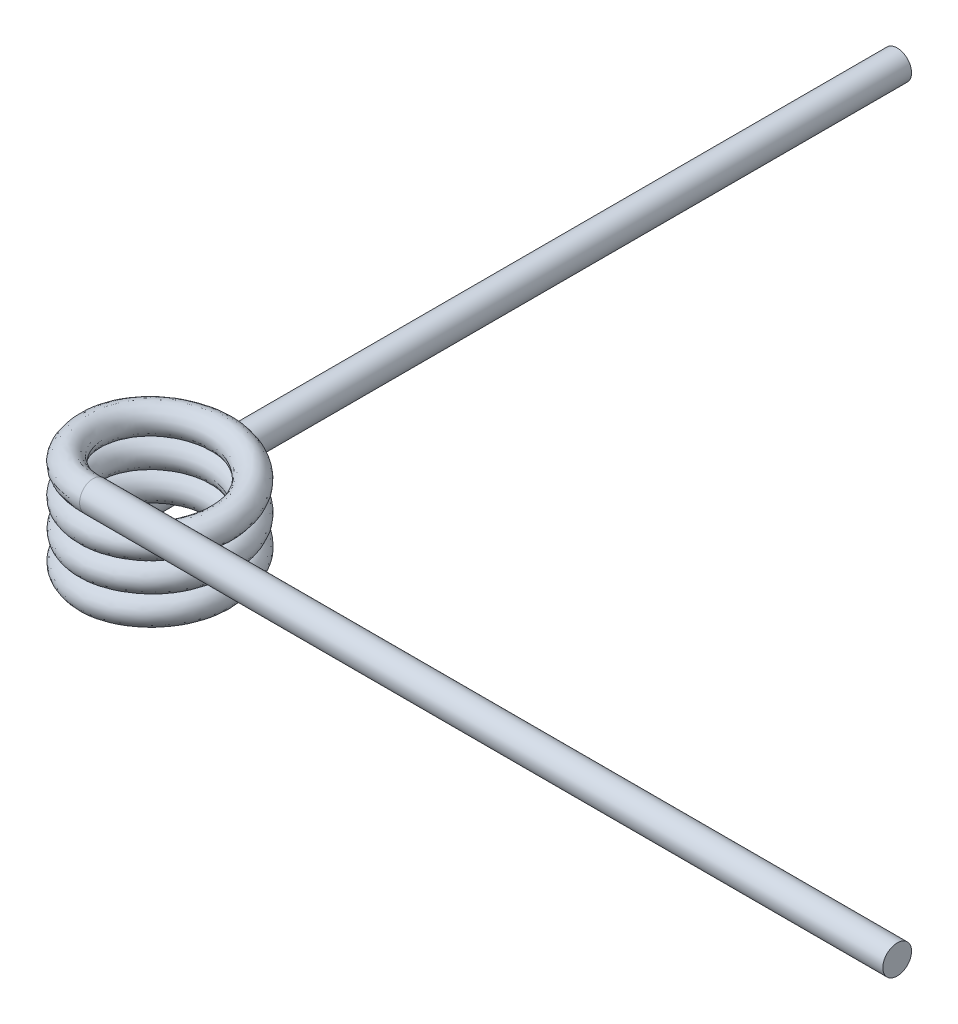
ISO-10303-21;
HEADER;
FILE_DESCRIPTION(('STEP AP214'),'2;1');
FILE_NAME('part.step','',(''),(''),'','','');
FILE_SCHEMA(('AUTOMOTIVE_DESIGN { 1 0 10303 214 1 1 1 1 }'));
ENDSEC;
DATA;
#1=APPLICATION_CONTEXT('core data for automotive mechanical design processes');
#2=APPLICATION_PROTOCOL_DEFINITION('international standard','automotive_design',2000,#1);
#3=PRODUCT_CONTEXT('',#1,'mechanical');
#4=PRODUCT('Part','Part','',(#3));
#5=PRODUCT_RELATED_PRODUCT_CATEGORY('part','',(#4));
#6=PRODUCT_DEFINITION_FORMATION('','',#4);
#7=PRODUCT_DEFINITION_CONTEXT('part definition',#1,'design');
#8=PRODUCT_DEFINITION('design','',#6,#7);
#9=PRODUCT_DEFINITION_SHAPE('','',#8);
#10=(LENGTH_UNIT() NAMED_UNIT(*) SI_UNIT(.MILLI.,.METRE.));
#11=(NAMED_UNIT(*) PLANE_ANGLE_UNIT() SI_UNIT($,.RADIAN.));
#12=(NAMED_UNIT(*) SI_UNIT($,.STERADIAN.) SOLID_ANGLE_UNIT());
#13=UNCERTAINTY_MEASURE_WITH_UNIT(LENGTH_MEASURE(1.E-05),#10,'distance_accuracy_value','');
#14=(GEOMETRIC_REPRESENTATION_CONTEXT(3) GLOBAL_UNCERTAINTY_ASSIGNED_CONTEXT((#13)) GLOBAL_UNIT_ASSIGNED_CONTEXT((#10,
#11,#12)) REPRESENTATION_CONTEXT('',''));
#15=CARTESIAN_POINT('',(0.,0.,0.));
#16=DIRECTION('',(0.,0.,1.));
#17=DIRECTION('',(1.,0.,0.));
#18=AXIS2_PLACEMENT_3D('',#15,#16,#17);
#19=CARTESIAN_POINT('',(50.,5.85,4.09999999999983));
#20=DIRECTION('',(-1.,0.,0.));
#21=DIRECTION('',(0.,0.,-1.));
#22=AXIS2_PLACEMENT_3D('',#19,#20,#21);
#23=PLANE('',#22);
#24=CARTESIAN_POINT('',(50.,5.85,4.09999999999983));
#25=DIRECTION('',(1.,0.,0.));
#26=DIRECTION('',(0.,0.,-1.));
#27=AXIS2_PLACEMENT_3D('',#24,#25,#26);
#28=CIRCLE('',#27,0.895);
#29=CARTESIAN_POINT('',(50.,5.85,3.20499999999983));
#30=VERTEX_POINT('',#29);
#31=EDGE_CURVE('E52',#30,#30,#28,.T.);
#32=ORIENTED_EDGE('',*,*,#31,.T.);
#33=EDGE_LOOP('',(#32));
#34=FACE_BOUND('',#33,.T.);
#35=ADVANCED_FACE('F37',(#34),#23,.F.);
#36=CARTESIAN_POINT('',(-4.09999999999998,0.,-50.));
#37=DIRECTION('',(0.,0.,-1.));
#38=DIRECTION('',(0.999999984999263,0.000173209334708053,0.));
#39=AXIS2_PLACEMENT_3D('',#36,#37,#38);
#40=PLANE('',#39);
#41=CARTESIAN_POINT('',(-4.09999999999998,0.,-50.));
#42=DIRECTION('',(0.,0.,1.));
#43=DIRECTION('',(0.999999984999263,0.000173209334708053,0.));
#44=AXIS2_PLACEMENT_3D('',#41,#42,#43);
#45=CIRCLE('',#44,0.895);
#46=CARTESIAN_POINT('',(-3.20500001342564,0.00015502235456631,-50.));
#47=VERTEX_POINT('',#46);
#48=EDGE_CURVE('E46',#47,#47,#45,.T.);
#49=ORIENTED_EDGE('',*,*,#48,.F.);
#50=EDGE_LOOP('',(#49));
#51=FACE_BOUND('',#50,.T.);
#52=ADVANCED_FACE('F121',(#51),#40,.T.);
#53=CARTESIAN_POINT('',(1.31838984174237E-13,5.85,4.1));
#54=DIRECTION('',(1.,0.,0.));
#55=DIRECTION('',(0.,0.,1.));
#56=AXIS2_PLACEMENT_3D('',#53,#54,#55);
#57=CYLINDRICAL_SURFACE('',#56,0.895);
#58=ORIENTED_EDGE('',*,*,#31,.F.);
#59=EDGE_LOOP('',(#58));
#60=FACE_BOUND('',#59,.T.);
#61=CARTESIAN_POINT('',(1.31838984174237E-13,5.85,4.1));
#62=DIRECTION('',(0.997567791117822,0.0697029563527303,0.));
#63=DIRECTION('',(0.,0.,-1.));
#64=AXIS2_PLACEMENT_3D('',#61,#62,#63);
#65=CIRCLE('',#64,0.895);
#66=CARTESIAN_POINT('',(1.12795573631392E-13,5.85,3.205));
#67=VERTEX_POINT('',#66);
#68=EDGE_CURVE('E40',#67,#67,#65,.T.);
#69=ORIENTED_EDGE('',*,*,#68,.T.);
#70=EDGE_LOOP('',(#69));
#71=FACE_BOUND('',#70,.T.);
#72=ADVANCED_FACE('F87',(#60,#71),#57,.T.);
#73=CARTESIAN_POINT('',(-3.20500001342565,0.000154645307818939,-1.08055164468879E-05));
#74=CARTESIAN_POINT('',(-3.2050013299972,0.0383816007414158,0.429189029505993));
#75=CARTESIAN_POINT('',(-3.11621796892935,0.0771385992123076,0.859326699102032));
#76=CARTESIAN_POINT('',(-2.45243955935918,0.228419514681997,2.43070850785631));
#77=CARTESIAN_POINT('',(-1.18164623743942,0.344924435274742,3.24288729839574));
#78=CARTESIAN_POINT('',(1.37560178644054,0.572610691536532,3.16417848126939));
#79=CARTESIAN_POINT('',(2.59908753937639,0.689622922267981,2.26746000231663));
#80=CARTESIAN_POINT('',(3.38450432639152,0.899813904964377,0.0389316529655378));
#81=CARTESIAN_POINT('',(3.17319911975832,0.998664578495864,-1.18478394792553));
#82=CARTESIAN_POINT('',(1.61077343776416,1.2193731730278,-3.08927138594743));
#83=CARTESIAN_POINT('',(0.0336030657551545,1.34066765999369,-3.48204795871798));
#84=CARTESIAN_POINT('',(-2.48737425252371,1.58467708717419,-2.43935441755975));
#85=CARTESIAN_POINT('',(-3.322439560533,1.70707492561746,-1.03900660883233));
#86=CARTESIAN_POINT('',(-3.06183280560357,1.94467420520004,1.61465694780401));
#87=CARTESIAN_POINT('',(-2.04402537359597,2.06370448888653,2.79072118364711));
#88=CARTESIAN_POINT('',(0.454572081571415,2.29289283740052,3.41914635713131));
#89=CARTESIAN_POINT('',(1.88054140060302,2.41038565352774,2.89060667753968));
#90=CARTESIAN_POINT('',(3.35125471925957,2.6368247590209,0.812960447732239));
#91=CARTESIAN_POINT('',(3.37502074409755,2.75446140942662,-0.708966098216149));
#92=CARTESIAN_POINT('',(1.96832642065917,2.9809954214511,-2.83175997687712));
#93=CARTESIAN_POINT('',(0.560300389829423,3.09837870307389,-3.4037317767149));
#94=CARTESIAN_POINT('',(-1.93173717038222,3.32531776364883,-2.85783840746567));
#95=CARTESIAN_POINT('',(-2.97104302840074,3.44223051348647,-1.75499005185013));
#96=CARTESIAN_POINT('',(-3.36311468203757,3.66969967839537,0.771859289282536));
#97=CARTESIAN_POINT('',(-2.71219328746953,3.78609667668421,2.1350278426114));
#98=CARTESIAN_POINT('',(-0.49269288598277,4.01407062177147,3.41626071029161));
#99=CARTESIAN_POINT('',(1.00925609570965,4.13000516148698,3.30176921345476));
#100=CARTESIAN_POINT('',(3.00943699413217,4.35839846983283,1.69204754801851));
#101=CARTESIAN_POINT('',(3.44385294100598,4.47397850478147,0.253189967894031));
#102=CARTESIAN_POINT('',(2.66448149747458,4.70265467495869,-2.19647338701847));
#103=CARTESIAN_POINT('',(1.48063915010857,4.81805237315276,-3.11975744358879));
#104=CARTESIAN_POINT('',(-1.0860007615064,5.04680580428563,-3.27808286597758));
#105=CARTESIAN_POINT('',(-2.37453223483457,5.16225905365727,-2.50687897809769));
#106=CARTESIAN_POINT('',(-3.44929881928071,5.39097281853296,-0.171010940190842));
#107=CARTESIAN_POINT('',(-3.19026859059207,5.50673521976878,1.31324440463397));
#108=CARTESIAN_POINT('',(-1.71006202555596,5.69621065459718,2.8408914428862));
#109=CARTESIAN_POINT('',(-0.864108123636782,5.77303766190829,3.20499855663933));
#110=CARTESIAN_POINT('',(1.07552855510562E-13,5.85,3.205));
#111=CARTESIAN_POINT('',(-3.20508118294069,0.467635758530262,-0.0326750674551346));
#112=CARTESIAN_POINT('',(-3.209385163449,0.50586145164813,0.39652019976706));
#113=CARTESIAN_POINT('',(-3.12511629615128,0.544618732220028,0.827609276396845));
#114=CARTESIAN_POINT('',(-2.47675118719805,0.69590068197791,2.40552581988831));
#115=CARTESIAN_POINT('',(-1.21470696330118,0.812405499347613,3.23116270038948));
#116=CARTESIAN_POINT('',(1.34335983245034,1.0400913620739,3.17798224951149));
#117=CARTESIAN_POINT('',(2.57628559744716,1.15710365428988,2.29407978511829));
#118=CARTESIAN_POINT('',(3.38391277510455,1.36729473519533,0.0733468933562186));
#119=CARTESIAN_POINT('',(3.18522709353604,1.46614622707909,-1.15238591074265));
#120=CARTESIAN_POINT('',(1.64240489399777,1.68685389120813,-3.07299605480319));
#121=CARTESIAN_POINT('',(0.0690983362146306,1.80815018750543,-3.48173995441145));
#122=CARTESIAN_POINT('',(-2.46256828416014,2.05215664156883,-2.46479951116549));
#123=CARTESIAN_POINT('',(-3.31211080521433,2.17455648932132,-1.07286434010239));
#124=CARTESIAN_POINT('',(-3.07814848353979,2.41215429136843,1.58345036589963));
#125=CARTESIAN_POINT('',(-2.07257100089001,2.53118523066888,2.77021266916508));
#126=CARTESIAN_POINT('',(0.41979803207613,2.76037367036715,3.42353808980824));
#127=CARTESIAN_POINT('',(1.85134039132263,2.87786639604855,2.90998180810748));
#128=CARTESIAN_POINT('',(3.34277111969176,3.10430559219509,0.846960681285954));
#129=CARTESIAN_POINT('',(3.38253511677856,3.22194215126531,-0.674735061786532));
#130=CARTESIAN_POINT('',(1.99697087948642,3.4484762553119,-2.81157044612987));
#131=CARTESIAN_POINT('',(0.594939503367396,3.56585944402734,-3.39835118225756));
#132=CARTESIAN_POINT('',(-1.90256864446002,3.79279859839674,-2.8772776066313));
#133=CARTESIAN_POINT('',(-2.953483213921,3.90971125378712,-1.78534203555492));
#134=CARTESIAN_POINT('',(-3.37073360333336,4.13718051379547,0.737633894115676));
#135=CARTESIAN_POINT('',(-2.73413829878706,4.25357741683089,2.10766498124113));
#136=CARTESIAN_POINT('',(-0.527373523544008,4.48155145732632,3.41102610081762));
#137=CARTESIAN_POINT('',(0.975798940463027,4.59748590193276,3.31232940981083));
#138=CARTESIAN_POINT('',(2.99204244235549,4.82587930508903,1.7225137225697));
#139=CARTESIAN_POINT('',(3.44159843242577,4.94145924612306,0.288207209889266));
#140=CARTESIAN_POINT('',(2.68662159118871,5.17013550929634,-2.16925219418923));
#141=CARTESIAN_POINT('',(1.51247654556927,5.28553311389776,-3.10500042821253));
#142=CARTESIAN_POINT('',(-1.05261914492358,5.51428664083588,-3.28889821745873));
#143=CARTESIAN_POINT('',(-2.34928619730383,5.62973985803506,-2.53124283296671));
#144=CARTESIAN_POINT('',(-3.44732865130242,5.85845353054291,-0.206047830751971));
#145=CARTESIAN_POINT('',(-3.20380871589026,5.97421546035903,1.28085890389312));
#146=CARTESIAN_POINT('',(-1.73890567232911,6.1636923833992,2.82337217634719));
#147=CARTESIAN_POINT('',(-0.896926756789582,6.24050524928003,3.19633600219198));
#148=CARTESIAN_POINT('',(-0.0326642624285667,6.31748112023501,3.205));
#149=CARTESIAN_POINT('',(-3.63153412522373,0.892904131751271,-0.0623898027550876));
#150=CARTESIAN_POINT('',(-3.63974965486505,0.931320754815126,0.425729451743245));
#151=CARTESIAN_POINT('',(-3.54837528343568,0.969718996339793,0.911664488432049));
#152=CARTESIAN_POINT('',(-2.82391099329299,1.12192048361994,2.70887626750492));
#153=CARTESIAN_POINT('',(-1.4048586983605,1.23725561079709,3.65200433027286));
#154=CARTESIAN_POINT('',(1.49993515739105,1.46583419222778,3.61139906964164));
#155=CARTESIAN_POINT('',(2.90033466372411,1.58193433780461,2.62272476417291));
#156=CARTESIAN_POINT('',(3.8344687862607,1.79300503787936,0.107467631307042));
#157=CARTESIAN_POINT('',(3.61763713209895,1.8916342839015,-1.28141877538018));
#158=CARTESIAN_POINT('',(1.88651556061936,2.11189824057867,-3.46795773284622));
#159=CARTESIAN_POINT('',(0.105762792600349,2.23347364836279,-3.9446805180003));
#160=CARTESIAN_POINT('',(-2.77030898463452,2.47735290409048,-2.81273929447469));
#161=CARTESIAN_POINT('',(-3.74493578059228,2.59950639288652,-1.24408983265405));
#162=CARTESIAN_POINT('',(-3.50014749856589,2.83775225198073,1.77168215969839));
#163=CARTESIAN_POINT('',(-2.3733812161966,2.95600637144514,3.12208763288304));
#164=CARTESIAN_POINT('',(0.451488872102087,3.18615240951107,3.88311913823876));
#165=CARTESIAN_POINT('',(2.07325677949654,3.30269824906851,3.31455899017708));
#166=CARTESIAN_POINT('',(3.78258592764624,3.5300835540239,0.98364853041262));
#167=CARTESIAN_POINT('',(3.83999202393256,3.64677383926392,-0.73546201115712));
#168=CARTESIAN_POINT('',(2.28326505746291,3.87425442864057,-3.17237671454517));
#169=CARTESIAN_POINT('',(0.703867173014298,3.99069032054049,-3.8469033252635));
#170=CARTESIAN_POINT('',(-2.13589700012175,4.2185776013483,-3.27452707626169));
#171=CARTESIAN_POINT('',(-3.33231028753508,4.3345410456852,-2.0493457227285));
#172=CARTESIAN_POINT('',(-3.82553123188503,4.56296059480471,0.81209664798876));
#173=CARTESIAN_POINT('',(-3.1174812327495,4.67840616156725,2.36532829997638));
#174=CARTESIAN_POINT('',(-0.621909926501579,4.90733259306863,3.8622261226911));
#175=CARTESIAN_POINT('',(1.07732087697,5.02231375463375,3.76304623356736));
#176=CARTESIAN_POINT('',(3.37888725535226,5.25166133721885,1.9734761753806));
#177=CARTESIAN_POINT('',(3.89860147231572,5.36628646203412,0.356573558952148));
#178=CARTESIAN_POINT('',(3.06033550703156,5.59591815175093,-2.43952266599124));
#179=CARTESIAN_POINT('',(1.74137954770347,5.71036037475177,-3.50643126480831));
#180=CARTESIAN_POINT('',(-1.16968758528683,5.94006937777568,-3.73502193920987));
#181=CARTESIAN_POINT('',(-2.6409716675378,6.05455841462305,-2.88961626577972));
#182=CARTESIAN_POINT('',(-3.90566514830589,6.28423921779579,-0.2579579394151));
#183=CARTESIAN_POINT('',(-3.64239277248086,6.39918772804201,1.42419709232077));
#184=CARTESIAN_POINT('',(-1.99163387395414,6.58926638210995,3.18641868227861));
#185=CARTESIAN_POINT('',(-1.04232496750708,6.66569567712396,3.61488719065627));
#186=CARTESIAN_POINT('',(-0.0623841459355748,6.74282317305046,3.63137909583952));
#187=CARTESIAN_POINT('',(-4.56877591948537,0.892742187563623,-0.0623784872447741));
#188=CARTESIAN_POINT('',(-4.57698645864984,0.931588191410899,0.555276356532607));
#189=CARTESIAN_POINT('',(-4.46096199558103,0.969189484900535,1.15986462767263));
#190=CARTESIAN_POINT('',(-3.53839429611191,1.12341017767838,3.42604901006823));
#191=CARTESIAN_POINT('',(-1.75671776622997,1.23617436612145,4.60052319798879));
#192=CARTESIAN_POINT('',(1.9085938668991,1.46671605714304,4.53650325898639));
#193=CARTESIAN_POINT('',(3.65824441769773,1.58081105187784,3.29189353770318));
#194=CARTESIAN_POINT('',(4.82603799070356,1.7938150834018,0.113639378469413));
#195=CARTESIAN_POINT('',(4.54407986150676,1.89195416474994,-1.62984741185049));
#196=CARTESIAN_POINT('',(2.35984256272712,2.11124465023328,-4.36869025715536));
#197=CARTESIAN_POINT('',(0.115365934031153,2.23342996604051,-4.96290563361561));
#198=CARTESIAN_POINT('',(-3.49637868729715,2.47703556800432,-3.52667016645441));
#199=CARTESIAN_POINT('',(-4.7170040582404,2.59864350620321,-1.55275232071589));
#200=CARTESIAN_POINT('',(-4.39512991131327,2.83831684179556,2.24785553953706));
#201=CARTESIAN_POINT('',(-2.97751353685964,2.95486208971451,3.93657580645617));
#202=CARTESIAN_POINT('',(0.590697938318274,3.18711288260974,4.88456008844739));
#203=CARTESIAN_POINT('',(2.61946253649889,3.30157751288672,4.16512683455915));
#204=CARTESIAN_POINT('',(4.7663285385226,3.53104231806558,1.21610736847518));
#205=CARTESIAN_POINT('',(4.8305185299199,3.64565274170817,-0.937410543351328));
#206=CARTESIAN_POINT('',(2.85529140338397,3.87521365621359,-4.0058591968373));
#207=CARTESIAN_POINT('',(0.874027434042758,3.9895674409825,-4.843645829254));
#208=CARTESIAN_POINT('',(-2.70712291569776,4.2195386507885,-4.10885943076595));
#209=CARTESIAN_POINT('',(-4.20014562648092,4.33341578330097,-2.56895935434275));
#210=CARTESIAN_POINT('',(-4.810003168602,4.56392401265826,1.04422714676765));
#211=CARTESIAN_POINT('',(-3.91623342250622,4.67727859768189,2.98643459143352));
#212=CARTESIAN_POINT('',(-0.760353091425209,4.90829832906471,4.86449707052414));
#213=CARTESIAN_POINT('',(1.36739482234989,5.02118422933347,4.73266543165534));
#214=CARTESIAN_POINT('',(4.26401619877042,5.25262904419554,2.46419494001424));
#215=CARTESIAN_POINT('',(4.90766807612492,5.36515553518513,0.436818019818215));
#216=CARTESIAN_POINT('',(3.83753158262272,5.59688720214761,-3.08805793332902));
#217=CARTESIAN_POINT('',(2.18086606497502,5.70922954789484,-4.41834728683702));
#218=CARTESIAN_POINT('',(-1.49378387678572,5.94103863143122,-4.69403453651333));
#219=CARTESIAN_POINT('',(-3.33262983224151,6.05340832728146,-3.62864425867248));
#220=CARTESIAN_POINT('',(-4.91709419902607,6.28521520574521,-0.301989949552291));
#221=CARTESIAN_POINT('',(-4.57938256731222,6.39837664709376,1.80404578928289));
#222=CARTESIAN_POINT('',(-2.4894790608199,6.58977501499452,4.01948499637931));
#223=CARTESIAN_POINT('',(-1.29626757767904,6.66521801984137,4.55221725522382));
#224=CARTESIAN_POINT('',(-0.062384145935547,6.74282317305046,4.56862090416048));
#225=CARTESIAN_POINT('',(-4.99508115608937,0.467326467914628,-0.032653456422331));
#226=CARTESIAN_POINT('',(-4.99937866541127,0.506371207474231,0.643944765590347));
#227=CARTESIAN_POINT('',(-4.86802853100669,0.543607439864323,1.30163662483337));
#228=CARTESIAN_POINT('',(-3.84131377999974,0.698745788054834,3.7752248642398));
#229=CARTESIAN_POINT('',(-1.88670828237957,0.81034047413361,5.04270029734298));
#230=CARTESIAN_POINT('',(2.12384047632025,1.04177559999489,4.94480110482388));
#231=CARTESIAN_POINT('',(4.0237866025986,1.15495833619669,3.57209800196496));
#232=CARTESIAN_POINT('',(5.27767045876032,1.3688418081838,0.0851340621722645));
#233=CARTESIAN_POINT('',(4.95460237205652,1.4667571544972,-1.81783558845582));
#234=CARTESIAN_POINT('',(2.54639287901098,1.68560562559823,-4.79326845856635));
#235=CARTESIAN_POINT('',(0.0874389853363724,1.80806676041514,-5.42640667837828));
#236=CARTESIAN_POINT('',(-3.84925927064302,2.05155057428811,-3.82830703878234));
#237=CARTESIAN_POINT('',(-5.1686244621413,2.17290849714882,-1.6623662687697));
#238=CARTESIAN_POINT('',(-4.78743898316778,2.41323257848738,2.49287453194305));
#239=CARTESIAN_POINT('',(-3.22637874226628,2.52899981354516,4.32577049613065));
#240=CARTESIAN_POINT('',(0.68566776420945,2.76220803886259,5.33614941909542));
#241=CARTESIAN_POINT('',(2.89451654540263,2.87572594760745,4.53444673052197));
#242=CARTESIAN_POINT('',(5.22158111069105,3.1061366966353,1.2909243590092));
#243=CARTESIAN_POINT('',(5.2743013930762,3.21980101265223,-1.06042834756264));
#244=CARTESIAN_POINT('',(3.0894607258715,3.4503082450303,-4.40340473058766));
#245=CARTESIAN_POINT('',(0.919921663301398,3.56371490204669,-5.30198914025674));
#246=CARTESIAN_POINT('',(-2.99352978150156,3.79463406761915,-4.47073502744094));
#247=CARTESIAN_POINT('',(-4.61092662171718,3.9075621609408,-2.77773097118621));
#248=CARTESIAN_POINT('',(-5.25093650409898,4.13902050635695,1.18097048999149));
#249=CARTESIAN_POINT('',(-4.25964261044663,4.25142392843903,3.29389061889319));
#250=CARTESIAN_POINT('',(-0.791780491966143,4.48339587721608,5.32522260879644));
#251=CARTESIAN_POINT('',(1.52979936770532,4.59532866751471,5.16416566932699));
#252=CARTESIAN_POINT('',(4.68251420177023,4.8277274892741,2.65971752727625));
#253=CARTESIAN_POINT('',(5.36877368728897,4.93929933494165,0.441462841108176));
#254=CARTESIAN_POINT('',(4.17095675737121,5.17198625922709,-3.40786331697198));
#255=CARTESIAN_POINT('',(2.35183396531087,5.28337339368804,-4.8466317392986));
#256=CARTESIAN_POINT('',(-1.6715974668707,5.51613777896152,-5.1204773616384));
#257=CARTESIAN_POINT('',(-3.67025598741383,5.62754335301039,-3.94268233077771));
#258=CARTESIAN_POINT('',(-5.37901584740831,5.86031753022135,-0.290142775578263));
#259=CARTESIAN_POINT('',(-4.99332740558665,5.97266640985421,2.00631647687337));
#260=CARTESIAN_POINT('',(-2.68971994093443,6.16466380065204,4.41441163809829));
#261=CARTESIAN_POINT('',(-1.38191218006724,6.23961801341894,4.98642717809151));
#262=CARTESIAN_POINT('',(-0.0326642624285112,6.31748112023501,4.995));
#263=CARTESIAN_POINT('',(-4.99491881705929,-0.467635758530259,0.0326750674550444));
#264=CARTESIAN_POINT('',(-4.99061818870413,-0.428588029900683,0.709301595140946));
#265=CARTESIAN_POINT('',(-4.85023187656284,-0.391352826151118,1.36507147024374));
#266=CARTESIAN_POINT('',(-3.79269052432201,-0.236216546536992,3.8255902401758));
#267=CARTESIAN_POINT('',(-1.82058683065605,-0.124621654012134,5.06614949335656));
#268=CARTESIAN_POINT('',(2.18832438430066,0.106814258920156,4.91719356833861));
#269=CARTESIAN_POINT('',(4.06939048645705,0.219996872152886,3.51885843636164));
#270=CARTESIAN_POINT('',(5.27885356133425,0.433880147721906,0.0163035813909029));
#271=CARTESIAN_POINT('',(4.93054642450108,0.531793857330738,-1.88263166282158));
#272=CARTESIAN_POINT('',(2.48312996654375,0.750644189237549,-4.82581912085481));
#273=CARTESIAN_POINT('',(0.0164484444174209,0.873101705391664,-5.42702268699133));
#274=CARTESIAN_POINT('',(-3.89887120737017,1.11659146549883,-3.77741685157086));
#275=CARTESIAN_POINT('',(-5.18928197277865,1.2379453697411,-1.59465080622957));
#276=CARTESIAN_POINT('',(-4.75480762729534,1.47827240615058,2.5552876957518));
#277=CARTESIAN_POINT('',(-3.1692874876782,1.59403832998046,4.36678752509325));
#278=CARTESIAN_POINT('',(0.75521586320002,1.82724637292932,5.32736595374299));
#279=CARTESIAN_POINT('',(2.95291856395772,1.94076446256582,4.49569646938638));
#280=CARTESIAN_POINT('',(5.23854830983234,2.17117503028693,1.22292389190177));
#281=CARTESIAN_POINT('',(5.2592726477142,2.28483952897483,-1.12889042042187));
#282=CARTESIAN_POINT('',(3.03217180821699,2.51534657730869,-4.44378379208217));
#283=CARTESIAN_POINT('',(0.850643436225454,2.6287534201398,-5.31275032917141));
#284=CARTESIAN_POINT('',(-3.05186683334595,2.85967239812334,-4.43185662910969));
#285=CARTESIAN_POINT('',(-4.64604625067667,2.9726006803395,-2.71702700377664));
#286=CARTESIAN_POINT('',(-5.2356986615074,3.20405883555674,1.24942128032521));
#287=CARTESIAN_POINT('',(-4.21575258781157,3.31646244814567,3.34861634163372));
#288=CARTESIAN_POINT('',(-0.722419216843666,3.54843420610639,5.33569182774441));
#289=CARTESIAN_POINT('',(1.59671367819288,3.66036718662315,5.14304527661485));
#290=CARTESIAN_POINT('',(4.71730330532929,3.8927658187617,2.59878517817387));
#291=CARTESIAN_POINT('',(5.37328270444939,4.00433785225846,0.371428357117707));
#292=CARTESIAN_POINT('',(4.12667656994295,4.23702459055178,-3.46230570263046));
#293=CARTESIAN_POINT('',(2.28815917438947,4.34841191219803,-4.87614577005183));
#294=CARTESIAN_POINT('',(-1.73836070003634,4.58117610586104,-5.09884665867539));
#295=CARTESIAN_POINT('',(-3.7207480624753,4.69258174425479,-3.89395462103967));
#296=CARTESIAN_POINT('',(-5.38295618336489,4.92535610620145,-0.220068994456006));
#297=CARTESIAN_POINT('',(-4.96624715499028,5.0377059286737,2.07108747835508));
#298=CARTESIAN_POINT('',(-2.63203264738812,5.22970034304801,4.44945017117631));
#299=CARTESIAN_POINT('',(-1.31624491432121,5.30467559237939,5.00357076513241));
#300=CARTESIAN_POINT('',(0.0326642624288373,5.382518879765,4.995));
#301=CARTESIAN_POINT('',(-4.56846587477624,-0.892904131751268,0.0623898027549974));
#302=CARTESIAN_POINT('',(-4.56025290188742,-0.854052408943415,0.680092627905203));
#303=CARTESIAN_POINT('',(-4.42697288927703,-0.816453090270881,1.28101625820854));
#304=CARTESIAN_POINT('',(-3.44553071823136,-0.662236348179018,3.52223979255918));
#305=CARTESIAN_POINT('',(-1.63043509559674,-0.54947176546019,4.64530786347248));
#306=CARTESIAN_POINT('',(2.03174905935995,-0.318928571235145,4.48377674820917));
#307=CARTESIAN_POINT('',(3.74534142018295,-0.204833811360422,3.19021345730703));
#308=CARTESIAN_POINT('',(4.82829755017568,0.00816984503666103,-0.0178171565599202));
#309=CARTESIAN_POINT('',(4.49813638594061,0.106305800507112,-1.75359879818893));
#310=CARTESIAN_POINT('',(2.23901929991913,0.325599839868524,-4.43085744280572));
#311=CARTESIAN_POINT('',(-0.0202160119622328,0.447778244535822,-4.96408212340551));
#312=CARTESIAN_POINT('',(-3.59113050690186,0.691395202975668,-3.42947706825863));
#313=CARTESIAN_POINT('',(-4.75645699739994,0.812995466174387,-1.42342531367184));
#314=CARTESIAN_POINT('',(-4.33280861226997,1.05267444553974,2.36705590194723));
#315=CARTESIAN_POINT('',(-2.8684772723658,1.16921718919984,4.0149125613782));
#316=CARTESIAN_POINT('',(0.723525023168363,1.40146763378968,4.86778490530963));
#317=CARTESIAN_POINT('',(2.73100217578382,1.51593260954728,4.09111928729973));
#318=CARTESIAN_POINT('',(4.79873350187787,1.7453970684567,1.08623604279215));
#319=CARTESIAN_POINT('',(4.80181574056019,1.86000784097764,-1.06816347106263));
#320=CARTESIAN_POINT('',(2.7458776302405,2.0895684039786,-4.08297752365552));
#321=CARTESIAN_POINT('',(0.741715766589917,2.20392254362806,-4.86419818616476));
#322=CARTESIAN_POINT('',(-2.81853847769558,2.43389339517036,-4.03460715948));
#323=CARTESIAN_POINT('',(-4.26721917706401,2.54777088844427,-2.45302331660306));
#324=CARTESIAN_POINT('',(-4.7809010329543,2.77827875454466,1.17495852645213));
#325=CARTESIAN_POINT('',(-3.83240965384912,2.89163370341358,3.09095302289848));
#326=CARTESIAN_POINT('',(-0.627882813886096,3.1226530703598,4.88449180587094));
#327=CARTESIAN_POINT('',(1.49519174169159,3.23553933392074,4.69232845285547));
#328=CARTESIAN_POINT('',(4.33045849232682,3.4669837866333,2.34782272536582));
#329=CARTESIAN_POINT('',(4.91627966455944,3.57951063634883,0.30306200806622));
#330=CARTESIAN_POINT('',(3.75296265410009,3.81124194809577,-3.19203523083987));
#331=CARTESIAN_POINT('',(2.05925617225527,3.92358465134117,-4.47471493345676));
#332=CARTESIAN_POINT('',(-1.62129225967308,4.15539336892408,-4.65272293692353));
#333=CARTESIAN_POINT('',(-3.42906259224134,4.26776318766823,-3.53558118822096));
#334=CARTESIAN_POINT('',(-4.92461968636143,4.49957041894714,-0.168158885798585));
#335=CARTESIAN_POINT('',(-4.52766309840252,4.61273366098646,1.92774928992742));
#336=CARTESIAN_POINT('',(-2.37930444576122,4.80412634434009,4.08640366524487));
#337=CARTESIAN_POINT('',(-1.17086184639572,4.87961206310345,4.58501660643573));
#338=CARTESIAN_POINT('',(0.0623841459358385,4.95717682694955,4.56862090416048));
#339=CARTESIAN_POINT('',(-3.63122408051461,-0.892742187563619,0.0623784872446839));
#340=CARTESIAN_POINT('',(-3.62300916923862,-0.854320198815289,0.550527247887731));
#341=CARTESIAN_POINT('',(-3.51438617713167,-0.815923578831623,1.03281611896796));
#342=CARTESIAN_POINT('',(-2.73104741541244,-0.663726042237458,2.80506704999588));
#343=CARTESIAN_POINT('',(-1.27857602772726,-0.548390520784541,3.69678899575655));
#344=CARTESIAN_POINT('',(1.6230903498519,-0.319810436150405,3.55867255886441));
#345=CARTESIAN_POINT('',(2.98743166620933,-0.203710525433655,2.52104468377675));
#346=CARTESIAN_POINT('',(3.83672834573282,0.00735979951421473,-0.0239889037222921));
#347=CARTESIAN_POINT('',(3.5716936565328,0.105985919658673,-1.40517016171862));
#348=CARTESIAN_POINT('',(1.76569229781138,0.326253430213917,-3.53012491849657));
#349=CARTESIAN_POINT('',(-0.0298191533930367,0.447821926858102,-3.94585700779021));
#350=CARTESIAN_POINT('',(-2.86506080423923,0.691712539061833,-2.71554619627891));
#351=CARTESIAN_POINT('',(-3.78438871975182,0.813858352857695,-1.11476282561001));
#352=CARTESIAN_POINT('',(-3.43782619952259,1.05210985572491,1.89088252210856));
#353=CARTESIAN_POINT('',(-2.26434495170276,1.17036147093046,3.20042438780798));
#354=CARTESIAN_POINT('',(0.584315956952176,1.400507160691,3.86634395509815));
#355=CARTESIAN_POINT('',(2.18479641878147,1.51705334572907,3.24055144291767));
#356=CARTESIAN_POINT('',(3.8149908910015,1.74443830441502,0.853777204729585));
#357=CARTESIAN_POINT('',(3.81128923457569,1.8611289385334,-0.866214938868427));
#358=CARTESIAN_POINT('',(2.17385128431661,2.08860917640559,-3.24949504136339));
#359=CARTESIAN_POINT('',(0.571555505561457,2.20504542318605,-3.86745568217425));
#360=CARTESIAN_POINT('',(-2.24731256211957,2.43293234573015,-3.20027480497574));
#361=CARTESIAN_POINT('',(-3.39938383811817,2.5488961508285,-1.93340968498881));
#362=CARTESIAN_POINT('',(-3.79642909623733,2.7773153366911,0.942828027673239));
#363=CARTESIAN_POINT('',(-3.03365746409809,2.89276126729894,2.46984673144134));
#364=CARTESIAN_POINT('',(-0.489439648956765,3.12168733436373,3.88222085803789));
#365=CARTESIAN_POINT('',(1.2051177963174,3.23666885922102,3.72270925476749));
#366=CARTESIAN_POINT('',(3.44532954890296,3.4660160796566,1.85710396073218));
#367=CARTESIAN_POINT('',(3.90721306075024,3.58064156319782,0.222817547200154));
#368=CARTESIAN_POINT('',(2.97576657850893,3.81027289769909,-2.54349996350208));
#369=CARTESIAN_POINT('',(1.61976965498372,3.9247154781981,-3.56279891142733));
#370=CARTESIAN_POINT('',(-1.29719596817419,4.15442411526854,-3.69371033962078));
#371=CARTESIAN_POINT('',(-2.73740442753763,4.26891327500982,-2.7965531953282));
#372=CARTESIAN_POINT('',(-3.91319063564124,4.49859443099772,-0.124126875661392));
#373=CARTESIAN_POINT('',(-3.59067330356549,4.6135447419347,1.54790059297097));
#374=CARTESIAN_POINT('',(-1.88145925889923,4.80361771145552,3.25333735114041));
#375=CARTESIAN_POINT('',(-0.916948145755179,4.88009684736118,3.64786145699056));
#376=CARTESIAN_POINT('',(0.0623841459358107,4.95717682694955,3.63137909583952));
#377=CARTESIAN_POINT('',(-3.20491884391061,-0.467326467914624,0.0326534564222408));
#378=CARTESIAN_POINT('',(-3.20061749654541,-0.429098250165299,0.461857859244925));
#379=CARTESIAN_POINT('',(-3.10731964170742,-0.390341533795413,0.891044121807219));
#380=CARTESIAN_POINT('',(-2.42812793152032,-0.239061652613916,2.45589119582431));
#381=CARTESIAN_POINT('',(-1.14858551157766,-0.12255662879813,3.254611896402));
#382=CARTESIAN_POINT('',(1.40784374043075,0.105130020999167,3.15037471302729));
#383=CARTESIAN_POINT('',(2.62188948130561,0.222142190246079,2.24084021951498));
#384=CARTESIAN_POINT('',(3.38509587767848,0.432333074733427,0.00451641257485707));
#385=CARTESIAN_POINT('',(3.1611711459806,0.531182929912633,-1.21718198510841));
#386=CARTESIAN_POINT('',(1.57914198153055,0.751892454847457,-3.10554671709166));
#387=CARTESIAN_POINT('',(-0.00189220470432172,0.873185132481959,-3.48235596302451));
#388=CARTESIAN_POINT('',(-2.51218022088729,1.11719753277955,-2.41390932395402));
#389=CARTESIAN_POINT('',(-3.33276831585167,1.2395933619136,-1.00514887756226));
#390=CARTESIAN_POINT('',(-3.04551712766735,1.47719411903164,1.64586352970839));
#391=CARTESIAN_POINT('',(-2.01547974630193,1.59622374710418,2.81122969812913));
#392=CARTESIAN_POINT('',(0.4893461310667,1.82541200443388,3.41475462445438));
#393=CARTESIAN_POINT('',(1.9097424098834,1.94290491100692,2.87123154697189));
#394=CARTESIAN_POINT('',(3.35973831882737,2.16934392584672,0.778960214178523));
#395=CARTESIAN_POINT('',(3.36750637141655,2.28698066758792,-0.743197134645765));
#396=CARTESIAN_POINT('',(1.93968196183192,2.5135145875903,-2.85194950762438));
#397=CARTESIAN_POINT('',(0.525661276291451,2.63089796212044,-3.40911237117223));
#398=CARTESIAN_POINT('',(-1.96090569630441,2.85783692890093,-2.83839920830004));
#399=CARTESIAN_POINT('',(-2.98860284288048,2.97474977318582,-1.72463806814535));
#400=CARTESIAN_POINT('',(-3.35549576074178,3.20221884299526,0.806084684449395));
#401=CARTESIAN_POINT('',(-2.690248276152,3.31861593653754,2.16239070398166));
#402=CARTESIAN_POINT('',(-0.458012248421532,3.54658978621663,3.42149531976559));
#403=CARTESIAN_POINT('',(1.04271325095628,3.6625244210412,3.29120901709869));
#404=CARTESIAN_POINT('',(3.02683154590886,3.89091763457663,1.66158137346732));
#405=CARTESIAN_POINT('',(3.44610744958619,4.00649776343987,0.218172725898796));
#406=CARTESIAN_POINT('',(2.64234140376045,4.23517384062104,-2.22369457984771));
#407=CARTESIAN_POINT('',(1.44880175464787,4.35057163240776,-3.13451445896505));
#408=CARTESIAN_POINT('',(-1.11938237808922,4.57932496773539,-3.26726751449643));
#409=CARTESIAN_POINT('',(-2.3997782723653,4.69477824927947,-2.48251512322867));
#410=CARTESIAN_POINT('',(-3.451268987259,4.92349210652301,-0.135974049629713));
#411=CARTESIAN_POINT('',(-3.17672846529389,5.03925497917852,1.34562990537483));
#412=CARTESIAN_POINT('',(-1.6812183787828,5.22872892579517,2.85841070942521));
#413=CARTESIAN_POINT('',(-0.831289490483982,5.30557007453656,3.21366111108668));
#414=CARTESIAN_POINT('',(0.0326642624287818,5.382518879765,3.205));
#415=CARTESIAN_POINT('',(-3.20500001342565,0.000154645307818939,-1.08055164468879E-05));
#416=CARTESIAN_POINT('',(-3.2050013299972,0.0383816007414158,0.429189029505993));
#417=CARTESIAN_POINT('',(-3.11621796892935,0.0771385992123076,0.859326699102032));
#418=CARTESIAN_POINT('',(-2.45243955935918,0.228419514681997,2.43070850785631));
#419=CARTESIAN_POINT('',(-1.18164623743942,0.344924435274742,3.24288729839574));
#420=CARTESIAN_POINT('',(1.37560178644054,0.572610691536532,3.16417848126939));
#421=CARTESIAN_POINT('',(2.59908753937639,0.689622922267981,2.26746000231663));
#422=CARTESIAN_POINT('',(3.38450432639152,0.899813904964377,0.0389316529655378));
#423=CARTESIAN_POINT('',(3.17319911975832,0.998664578495864,-1.18478394792553));
#424=CARTESIAN_POINT('',(1.61077343776416,1.2193731730278,-3.08927138594743));
#425=CARTESIAN_POINT('',(0.0336030657551545,1.34066765999369,-3.48204795871798));
#426=CARTESIAN_POINT('',(-2.48737425252371,1.58467708717419,-2.43935441755975));
#427=CARTESIAN_POINT('',(-3.322439560533,1.70707492561746,-1.03900660883233));
#428=CARTESIAN_POINT('',(-3.06183280560357,1.94467420520004,1.61465694780401));
#429=CARTESIAN_POINT('',(-2.04402537359597,2.06370448888653,2.79072118364711));
#430=CARTESIAN_POINT('',(0.454572081571415,2.29289283740052,3.41914635713131));
#431=CARTESIAN_POINT('',(1.88054140060302,2.41038565352774,2.89060667753968));
#432=CARTESIAN_POINT('',(3.35125471925957,2.6368247590209,0.812960447732239));
#433=CARTESIAN_POINT('',(3.37502074409755,2.75446140942662,-0.708966098216149));
#434=CARTESIAN_POINT('',(1.96832642065917,2.9809954214511,-2.83175997687712));
#435=CARTESIAN_POINT('',(0.560300389829423,3.09837870307389,-3.4037317767149));
#436=CARTESIAN_POINT('',(-1.93173717038222,3.32531776364883,-2.85783840746567));
#437=CARTESIAN_POINT('',(-2.97104302840074,3.44223051348647,-1.75499005185013));
#438=CARTESIAN_POINT('',(-3.36311468203757,3.66969967839537,0.771859289282536));
#439=CARTESIAN_POINT('',(-2.71219328746953,3.78609667668421,2.1350278426114));
#440=CARTESIAN_POINT('',(-0.49269288598277,4.01407062177147,3.41626071029161));
#441=CARTESIAN_POINT('',(1.00925609570965,4.13000516148698,3.30176921345476));
#442=CARTESIAN_POINT('',(3.00943699413217,4.35839846983283,1.69204754801851));
#443=CARTESIAN_POINT('',(3.44385294100598,4.47397850478147,0.253189967894031));
#444=CARTESIAN_POINT('',(2.66448149747458,4.70265467495869,-2.19647338701847));
#445=CARTESIAN_POINT('',(1.48063915010857,4.81805237315276,-3.11975744358879));
#446=CARTESIAN_POINT('',(-1.0860007615064,5.04680580428563,-3.27808286597758));
#447=CARTESIAN_POINT('',(-2.37453223483457,5.16225905365727,-2.50687897809769));
#448=CARTESIAN_POINT('',(-3.44929881928071,5.39097281853296,-0.171010940190842));
#449=CARTESIAN_POINT('',(-3.19026859059207,5.50673521976878,1.31324440463397));
#450=CARTESIAN_POINT('',(-1.71006202555596,5.69621065459718,2.8408914428862));
#451=CARTESIAN_POINT('',(-0.864108123636782,5.77303766190829,3.20499855663933));
#452=CARTESIAN_POINT('',(1.07552855510562E-13,5.85,3.205));
#453=B_SPLINE_SURFACE_WITH_KNOTS('',3,3,((#73,#74,#75,#76,#77,#78,#79,#80,#81,#82,#83,#84,#85,
#86,#87,#88,#89,#90,#91,#92,#93,#94,#95,#96,#97,#98,#99,#100,#101,#102,#103,#104,#105,#106,#107,
#108,#109,#110),(#111,#112,#113,#114,#115,#116,#117,#118,#119,#120,#121,#122,#123,#124,#125,
#126,#127,#128,#129,#130,#131,#132,#133,#134,#135,#136,#137,#138,#139,#140,#141,#142,#143,#144,
#145,#146,#147,#148),(#149,#150,#151,#152,#153,#154,#155,#156,#157,#158,#159,#160,#161,#162,
#163,#164,#165,#166,#167,#168,#169,#170,#171,#172,#173,#174,#175,#176,#177,#178,#179,#180,#181,
#182,#183,#184,#185,#186),(#187,#188,#189,#190,#191,#192,#193,#194,#195,#196,#197,#198,#199,
#200,#201,#202,#203,#204,#205,#206,#207,#208,#209,#210,#211,#212,#213,#214,#215,#216,#217,#218,
#219,#220,#221,#222,#223,#224),(#225,#226,#227,#228,#229,#230,#231,#232,#233,#234,#235,#236,
#237,#238,#239,#240,#241,#242,#243,#244,#245,#246,#247,#248,#249,#250,#251,#252,#253,#254,#255,
#256,#257,#258,#259,#260,#261,#262),(#263,#264,#265,#266,#267,#268,#269,#270,#271,#272,#273,
#274,#275,#276,#277,#278,#279,#280,#281,#282,#283,#284,#285,#286,#287,#288,#289,#290,#291,#292,
#293,#294,#295,#296,#297,#298,#299,#300),(#301,#302,#303,#304,#305,#306,#307,#308,#309,#310,
#311,#312,#313,#314,#315,#316,#317,#318,#319,#320,#321,#322,#323,#324,#325,#326,#327,#328,#329,
#330,#331,#332,#333,#334,#335,#336,#337,#338),(#339,#340,#341,#342,#343,#344,#345,#346,#347,
#348,#349,#350,#351,#352,#353,#354,#355,#356,#357,#358,#359,#360,#361,#362,#363,#364,#365,#366,
#367,#368,#369,#370,#371,#372,#373,#374,#375,#376),(#377,#378,#379,#380,#381,#382,#383,#384,
#385,#386,#387,#388,#389,#390,#391,#392,#393,#394,#395,#396,#397,#398,#399,#400,#401,#402,#403,
#404,#405,#406,#407,#408,#409,#410,#411,#412,#413,#414),(#415,#416,#417,#418,#419,#420,#421,
#422,#423,#424,#425,#426,#427,#428,#429,#430,#431,#432,#433,#434,#435,#436,#437,#438,#439,#440,
#441,#442,#443,#444,#445,#446,#447,#448,#449,#450,#451,#452)),.UNSPECIFIED.,.T.,.F.,.F.,(4,2,2,
2,4),(4,2,2,2,2,2,2,2,2,2,2,2,2,2,2,2,2,2,4),(0.,0.25,0.5,0.75,1.),(0.,0.0195010392474706,
0.0784740499888805,0.137291933217268,0.1875,0.25,0.3125,0.372545765020526,0.431356824726651,
0.490166296944194,0.54897995832147,0.607800052291475,0.666625753063569,0.725457984213477,
0.784297269691342,0.843140641936414,0.9019829962548,0.960888853611566,1.),.UNSPECIFIED.);
#454=CARTESIAN_POINT('',(-4.09999999999999,0.,0.));
#455=DIRECTION('',(0.,0.,1.));
#456=DIRECTION('',(0.999999984999263,0.000173209334708053,0.));
#457=AXIS2_PLACEMENT_3D('',#454,#455,#456);
#458=CIRCLE('',#457,0.895);
#459=CARTESIAN_POINT('',(-3.20500001341749,0.000154786756759906,-5.40183474597746E-06));
#460=VERTEX_POINT('',#459);
#461=EDGE_CURVE('E11',#460,#460,#458,.T.);
#462=ORIENTED_EDGE('',*,*,#68,.F.);
#463=EDGE_LOOP('',(#462));
#464=FACE_BOUND('',#463,.T.);
#465=ORIENTED_EDGE('',*,*,#461,.T.);
#466=EDGE_LOOP('',(#465));
#467=FACE_BOUND('',#466,.T.);
#468=ADVANCED_FACE('F65',(#464,#467),#453,.T.);
#469=CARTESIAN_POINT('',(-4.09999999999998,0.,-50.));
#470=DIRECTION('',(0.,0.,1.));
#471=DIRECTION('',(-1.,0.,0.));
#472=AXIS2_PLACEMENT_3D('',#469,#470,#471);
#473=CYLINDRICAL_SURFACE('',#472,0.895);
#474=ORIENTED_EDGE('',*,*,#461,.F.);
#475=EDGE_LOOP('',(#474));
#476=FACE_BOUND('',#475,.T.);
#477=ORIENTED_EDGE('',*,*,#48,.T.);
#478=EDGE_LOOP('',(#477));
#479=FACE_BOUND('',#478,.T.);
#480=ADVANCED_FACE('F86',(#476,#479),#473,.T.);
#481=CLOSED_SHELL('',(#35,#52,#72,#468,#480));
#482=MANIFOLD_SOLID_BREP('B2',#481);
#483=ADVANCED_BREP_SHAPE_REPRESENTATION('',(#18,#482),#14);
#484=SHAPE_DEFINITION_REPRESENTATION(#9,#483);
ENDSEC;
END-ISO-10303-21;
